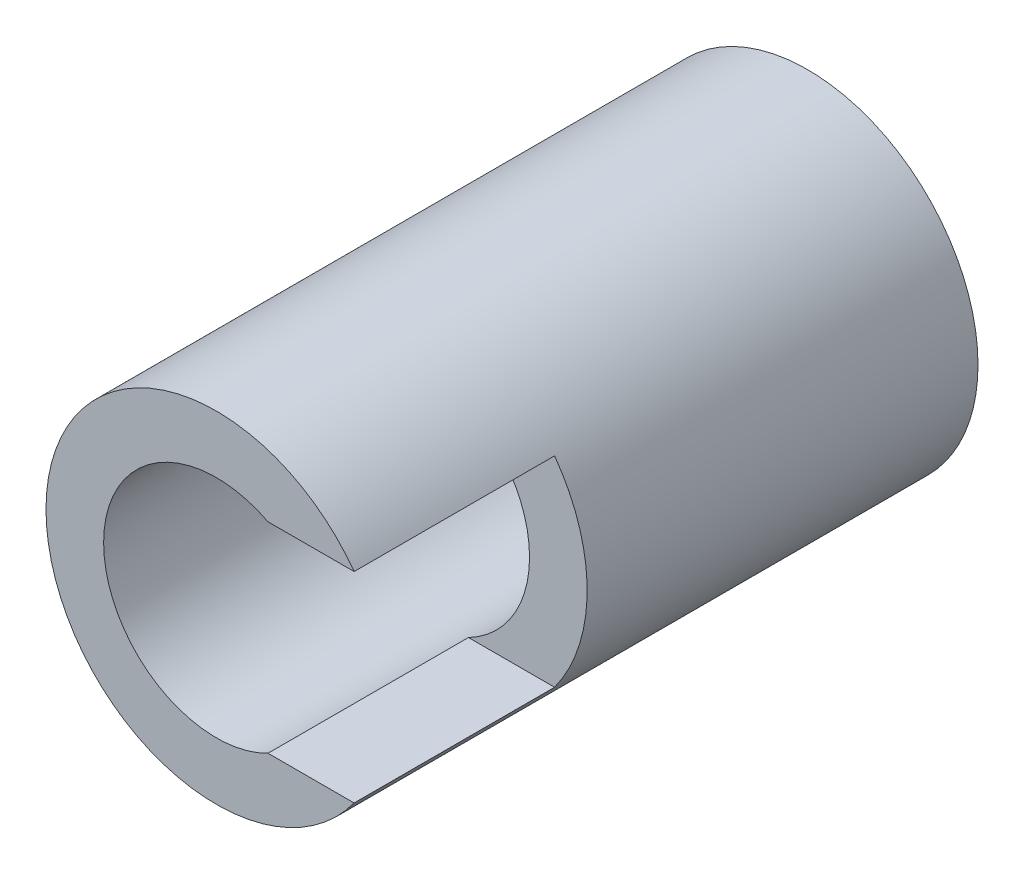
ISO-10303-21;
HEADER;
FILE_DESCRIPTION(('STEP AP214'),'2;1');
FILE_NAME('part.step','',(''),(''),'','','');
FILE_SCHEMA(('AUTOMOTIVE_DESIGN { 1 0 10303 214 1 1 1 1 }'));
ENDSEC;
DATA;
#1=APPLICATION_CONTEXT('core data for automotive mechanical design processes');
#2=APPLICATION_PROTOCOL_DEFINITION('international standard','automotive_design',2000,#1);
#3=PRODUCT_CONTEXT('',#1,'mechanical');
#4=PRODUCT('Part','Part','',(#3));
#5=PRODUCT_RELATED_PRODUCT_CATEGORY('part','',(#4));
#6=PRODUCT_DEFINITION_FORMATION('','',#4);
#7=PRODUCT_DEFINITION_CONTEXT('part definition',#1,'design');
#8=PRODUCT_DEFINITION('design','',#6,#7);
#9=PRODUCT_DEFINITION_SHAPE('','',#8);
#10=(LENGTH_UNIT() NAMED_UNIT(*) SI_UNIT(.MILLI.,.METRE.));
#11=(NAMED_UNIT(*) PLANE_ANGLE_UNIT() SI_UNIT($,.RADIAN.));
#12=(NAMED_UNIT(*) SI_UNIT($,.STERADIAN.) SOLID_ANGLE_UNIT());
#13=UNCERTAINTY_MEASURE_WITH_UNIT(LENGTH_MEASURE(1.E-05),#10,'distance_accuracy_value','');
#14=(GEOMETRIC_REPRESENTATION_CONTEXT(3) GLOBAL_UNCERTAINTY_ASSIGNED_CONTEXT((#13)) GLOBAL_UNIT_ASSIGNED_CONTEXT((#10,
#11,#12)) REPRESENTATION_CONTEXT('',''));
#15=CARTESIAN_POINT('',(0.,0.,0.));
#16=DIRECTION('',(0.,0.,1.));
#17=DIRECTION('',(1.,0.,0.));
#18=AXIS2_PLACEMENT_3D('',#15,#16,#17);
#19=CARTESIAN_POINT('',(0.,0.,11.8));
#20=DIRECTION('',(0.,0.,1.));
#21=DIRECTION('',(1.,0.,0.));
#22=AXIS2_PLACEMENT_3D('',#19,#20,#21);
#23=PLANE('',#22);
#24=DIRECTION('',(1.,0.,0.));
#25=VECTOR('',#24,1.);
#26=CARTESIAN_POINT('',(-0.915652670086804,-2.,11.8));
#27=LINE('',#26,#25);
#28=CARTESIAN_POINT('',(1.03077640640441,-2.,11.8));
#29=VERTEX_POINT('',#28);
#30=CARTESIAN_POINT('',(2.7495454169735,-2.,11.8));
#31=VERTEX_POINT('',#30);
#32=EDGE_CURVE('E95',#29,#31,#27,.T.);
#33=ORIENTED_EDGE('',*,*,#32,.F.);
#34=CARTESIAN_POINT('',(0.,0.,11.8));
#35=DIRECTION('',(0.,0.,1.));
#36=DIRECTION('',(1.,0.,0.));
#37=AXIS2_PLACEMENT_3D('',#34,#35,#36);
#38=CIRCLE('',#37,2.25);
#39=CARTESIAN_POINT('',(1.03077640640442,2.,11.8));
#40=VERTEX_POINT('',#39);
#41=EDGE_CURVE('E94',#40,#29,#38,.T.);
#42=ORIENTED_EDGE('',*,*,#41,.F.);
#43=DIRECTION('',(-1.,0.,0.));
#44=VECTOR('',#43,1.);
#45=CARTESIAN_POINT('',(-0.915652670086805,2.,11.8));
#46=LINE('',#45,#44);
#47=CARTESIAN_POINT('',(2.7495454169735,2.,11.8));
#48=VERTEX_POINT('',#47);
#49=EDGE_CURVE('E82',#48,#40,#46,.T.);
#50=ORIENTED_EDGE('',*,*,#49,.F.);
#51=CARTESIAN_POINT('',(0.,0.,11.8));
#52=DIRECTION('',(0.,0.,1.));
#53=DIRECTION('',(1.,0.,0.));
#54=AXIS2_PLACEMENT_3D('',#51,#52,#53);
#55=CIRCLE('',#54,3.4);
#56=EDGE_CURVE('E92',#48,#31,#55,.T.);
#57=ORIENTED_EDGE('',*,*,#56,.T.);
#58=EDGE_LOOP('',(#33,#42,#50,#57));
#59=FACE_BOUND('',#58,.T.);
#60=ADVANCED_FACE('F41',(#59),#23,.T.);
#61=CARTESIAN_POINT('',(0.,0.,0.));
#62=DIRECTION('',(0.,0.,1.));
#63=DIRECTION('',(1.,0.,0.));
#64=AXIS2_PLACEMENT_3D('',#61,#62,#63);
#65=PLANE('',#64);
#66=CARTESIAN_POINT('',(0.,0.,0.));
#67=DIRECTION('',(0.,0.,1.));
#68=DIRECTION('',(1.,0.,0.));
#69=AXIS2_PLACEMENT_3D('',#66,#67,#68);
#70=CIRCLE('',#69,3.4);
#71=CARTESIAN_POINT('',(3.4,0.,0.));
#72=VERTEX_POINT('',#71);
#73=EDGE_CURVE('E100',#72,#72,#70,.T.);
#74=ORIENTED_EDGE('',*,*,#73,.F.);
#75=EDGE_LOOP('',(#74));
#76=FACE_BOUND('',#75,.T.);
#77=CARTESIAN_POINT('',(0.,0.,0.));
#78=DIRECTION('',(0.,0.,1.));
#79=DIRECTION('',(1.,0.,0.));
#80=AXIS2_PLACEMENT_3D('',#77,#78,#79);
#81=CIRCLE('',#80,2.25);
#82=CARTESIAN_POINT('',(2.25,0.,0.));
#83=VERTEX_POINT('',#82);
#84=EDGE_CURVE('E106',#83,#83,#81,.T.);
#85=ORIENTED_EDGE('',*,*,#84,.T.);
#86=EDGE_LOOP('',(#85));
#87=FACE_BOUND('',#86,.T.);
#88=ADVANCED_FACE('F126',(#76,#87),#65,.F.);
#89=CARTESIAN_POINT('',(0.,0.,11.8));
#90=DIRECTION('',(0.,0.,-1.));
#91=DIRECTION('',(-1.,0.,0.));
#92=AXIS2_PLACEMENT_3D('',#89,#90,#91);
#93=CYLINDRICAL_SURFACE('',#92,3.4);
#94=CARTESIAN_POINT('',(0.,0.,7.8));
#95=DIRECTION('',(0.,0.,-1.));
#96=DIRECTION('',(-1.,0.,0.));
#97=AXIS2_PLACEMENT_3D('',#94,#95,#96);
#98=CIRCLE('',#97,3.4);
#99=CARTESIAN_POINT('',(2.7495454169735,2.,7.8));
#100=VERTEX_POINT('',#99);
#101=CARTESIAN_POINT('',(2.7495454169735,-2.,7.8));
#102=VERTEX_POINT('',#101);
#103=EDGE_CURVE('E61',#100,#102,#98,.T.);
#104=ORIENTED_EDGE('',*,*,#103,.T.);
#105=DIRECTION('',(0.,0.,-1.));
#106=VECTOR('',#105,1.);
#107=CARTESIAN_POINT('',(2.7495454169735,-2.,11.8));
#108=LINE('',#107,#106);
#109=EDGE_CURVE('E86',#102,#31,#108,.F.);
#110=ORIENTED_EDGE('',*,*,#109,.T.);
#111=ORIENTED_EDGE('',*,*,#56,.F.);
#112=DIRECTION('',(0.,0.,-1.));
#113=VECTOR('',#112,1.);
#114=CARTESIAN_POINT('',(2.7495454169735,2.,11.8));
#115=LINE('',#114,#113);
#116=EDGE_CURVE('E79',#48,#100,#115,.T.);
#117=ORIENTED_EDGE('',*,*,#116,.T.);
#118=EDGE_LOOP('',(#104,#110,#111,#117));
#119=FACE_BOUND('',#118,.T.);
#120=ORIENTED_EDGE('',*,*,#73,.T.);
#121=EDGE_LOOP('',(#120));
#122=FACE_BOUND('',#121,.T.);
#123=ADVANCED_FACE('F43',(#119,#122),#93,.T.);
#124=CARTESIAN_POINT('',(0.,0.,11.8));
#125=DIRECTION('',(0.,0.,-1.));
#126=DIRECTION('',(-1.,0.,0.));
#127=AXIS2_PLACEMENT_3D('',#124,#125,#126);
#128=CYLINDRICAL_SURFACE('',#127,2.25);
#129=DIRECTION('',(0.,0.,-1.));
#130=VECTOR('',#129,1.);
#131=CARTESIAN_POINT('',(1.03077640640441,-2.,11.8));
#132=LINE('',#131,#130);
#133=CARTESIAN_POINT('',(1.03077640640441,-2.,7.8));
#134=VERTEX_POINT('',#133);
#135=EDGE_CURVE('E11',#134,#29,#132,.F.);
#136=ORIENTED_EDGE('',*,*,#135,.F.);
#137=CARTESIAN_POINT('',(0.,0.,7.8));
#138=DIRECTION('',(0.,0.,-1.));
#139=DIRECTION('',(-1.,0.,0.));
#140=AXIS2_PLACEMENT_3D('',#137,#138,#139);
#141=CIRCLE('',#140,2.25);
#142=CARTESIAN_POINT('',(1.03077640640442,2.,7.8));
#143=VERTEX_POINT('',#142);
#144=EDGE_CURVE('E99',#143,#134,#141,.T.);
#145=ORIENTED_EDGE('',*,*,#144,.F.);
#146=DIRECTION('',(0.,0.,-1.));
#147=VECTOR('',#146,1.);
#148=CARTESIAN_POINT('',(1.03077640640442,2.,11.8));
#149=LINE('',#148,#147);
#150=EDGE_CURVE('E49',#40,#143,#149,.T.);
#151=ORIENTED_EDGE('',*,*,#150,.F.);
#152=ORIENTED_EDGE('',*,*,#41,.T.);
#153=EDGE_LOOP('',(#136,#145,#151,#152));
#154=FACE_BOUND('',#153,.T.);
#155=ORIENTED_EDGE('',*,*,#84,.F.);
#156=EDGE_LOOP('',(#155));
#157=FACE_BOUND('',#156,.T.);
#158=ADVANCED_FACE('F111',(#154,#157),#128,.F.);
#159=CARTESIAN_POINT('',(-0.915652670086804,-2.,7.8));
#160=DIRECTION('',(0.,-1.,0.));
#161=DIRECTION('',(0.,0.,-1.));
#162=AXIS2_PLACEMENT_3D('',#159,#160,#161);
#163=PLANE('',#162);
#164=DIRECTION('',(1.,0.,0.));
#165=VECTOR('',#164,1.);
#166=CARTESIAN_POINT('',(-0.915652670086804,-2.,7.8));
#167=LINE('',#166,#165);
#168=EDGE_CURVE('E115',#134,#102,#167,.T.);
#169=ORIENTED_EDGE('',*,*,#168,.F.);
#170=ORIENTED_EDGE('',*,*,#135,.T.);
#171=ORIENTED_EDGE('',*,*,#32,.T.);
#172=ORIENTED_EDGE('',*,*,#109,.F.);
#173=EDGE_LOOP('',(#169,#170,#171,#172));
#174=FACE_BOUND('',#173,.T.);
#175=ADVANCED_FACE('F117',(#174),#163,.F.);
#176=CARTESIAN_POINT('',(-0.915652670086805,2.,7.8));
#177=DIRECTION('',(0.,1.,0.));
#178=DIRECTION('',(0.,0.,1.));
#179=AXIS2_PLACEMENT_3D('',#176,#177,#178);
#180=PLANE('',#179);
#181=ORIENTED_EDGE('',*,*,#49,.T.);
#182=ORIENTED_EDGE('',*,*,#150,.T.);
#183=DIRECTION('',(-1.,0.,0.));
#184=VECTOR('',#183,1.);
#185=CARTESIAN_POINT('',(-0.915652670086805,2.,7.8));
#186=LINE('',#185,#184);
#187=EDGE_CURVE('E56',#100,#143,#186,.T.);
#188=ORIENTED_EDGE('',*,*,#187,.F.);
#189=ORIENTED_EDGE('',*,*,#116,.F.);
#190=EDGE_LOOP('',(#181,#182,#188,#189));
#191=FACE_BOUND('',#190,.T.);
#192=ADVANCED_FACE('F81',(#191),#180,.F.);
#193=CARTESIAN_POINT('',(0.,0.,7.8));
#194=DIRECTION('',(0.,0.,-1.));
#195=DIRECTION('',(-1.,0.,0.));
#196=AXIS2_PLACEMENT_3D('',#193,#194,#195);
#197=PLANE('',#196);
#198=ORIENTED_EDGE('',*,*,#187,.T.);
#199=ORIENTED_EDGE('',*,*,#144,.T.);
#200=ORIENTED_EDGE('',*,*,#168,.T.);
#201=ORIENTED_EDGE('',*,*,#103,.F.);
#202=EDGE_LOOP('',(#198,#199,#200,#201));
#203=FACE_BOUND('',#202,.T.);
#204=ADVANCED_FACE('F114',(#203),#197,.F.);
#205=CLOSED_SHELL('',(#60,#88,#123,#158,#175,#192,#204));
#206=MANIFOLD_SOLID_BREP('B2',#205);
#207=ADVANCED_BREP_SHAPE_REPRESENTATION('',(#18,#206),#14);
#208=SHAPE_DEFINITION_REPRESENTATION(#9,#207);
ENDSEC;
END-ISO-10303-21;
